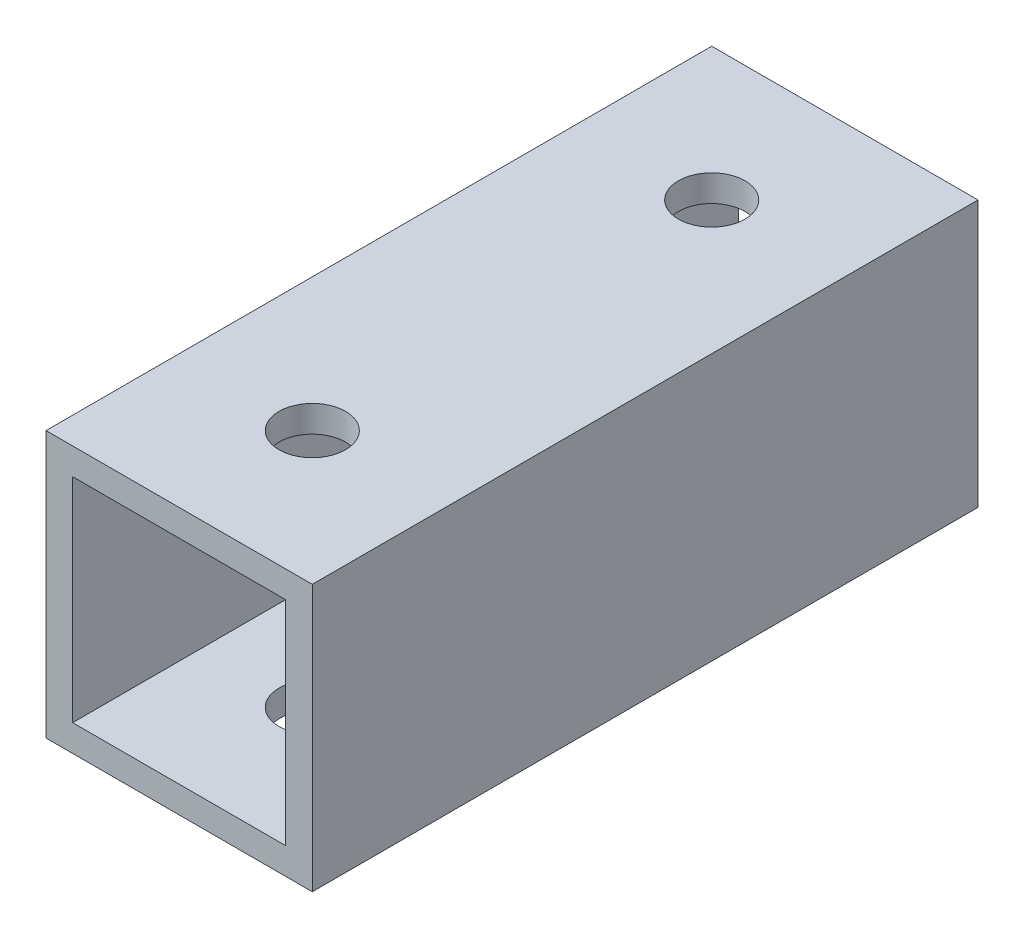
ISO-10303-21;
HEADER;
FILE_DESCRIPTION(('STEP AP214'),'2;1');
FILE_NAME('part.step','',(''),(''),'','','');
FILE_SCHEMA(('AUTOMOTIVE_DESIGN { 1 0 10303 214 1 1 1 1 }'));
ENDSEC;
DATA;
#1=APPLICATION_CONTEXT('core data for automotive mechanical design processes');
#2=APPLICATION_PROTOCOL_DEFINITION('international standard','automotive_design',2000,#1);
#3=PRODUCT_CONTEXT('',#1,'mechanical');
#4=PRODUCT('Part','Part','',(#3));
#5=PRODUCT_RELATED_PRODUCT_CATEGORY('part','',(#4));
#6=PRODUCT_DEFINITION_FORMATION('','',#4);
#7=PRODUCT_DEFINITION_CONTEXT('part definition',#1,'design');
#8=PRODUCT_DEFINITION('design','',#6,#7);
#9=PRODUCT_DEFINITION_SHAPE('','',#8);
#10=(LENGTH_UNIT() NAMED_UNIT(*) SI_UNIT(.MILLI.,.METRE.));
#11=(NAMED_UNIT(*) PLANE_ANGLE_UNIT() SI_UNIT($,.RADIAN.));
#12=(NAMED_UNIT(*) SI_UNIT($,.STERADIAN.) SOLID_ANGLE_UNIT());
#13=UNCERTAINTY_MEASURE_WITH_UNIT(LENGTH_MEASURE(1.E-05),#10,'distance_accuracy_value','');
#14=(GEOMETRIC_REPRESENTATION_CONTEXT(3) GLOBAL_UNCERTAINTY_ASSIGNED_CONTEXT((#13)) GLOBAL_UNIT_ASSIGNED_CONTEXT((#10,
#11,#12)) REPRESENTATION_CONTEXT('',''));
#15=CARTESIAN_POINT('',(0.,0.,0.));
#16=DIRECTION('',(0.,0.,1.));
#17=DIRECTION('',(1.,0.,0.));
#18=AXIS2_PLACEMENT_3D('',#15,#16,#17);
#19=CARTESIAN_POINT('',(0.,0.,50.));
#20=DIRECTION('',(0.,0.,-1.));
#21=DIRECTION('',(-1.,0.,0.));
#22=AXIS2_PLACEMENT_3D('',#19,#20,#21);
#23=PLANE('',#22);
#24=DIRECTION('',(0.,1.,0.));
#25=VECTOR('',#24,1.);
#26=CARTESIAN_POINT('',(10.,-10.,50.));
#27=LINE('',#26,#25);
#28=CARTESIAN_POINT('',(10.,-10.,50.));
#29=VERTEX_POINT('',#28);
#30=CARTESIAN_POINT('',(10.,10.,50.));
#31=VERTEX_POINT('',#30);
#32=EDGE_CURVE('E162',#29,#31,#27,.T.);
#33=ORIENTED_EDGE('',*,*,#32,.T.);
#34=DIRECTION('',(-1.,0.,0.));
#35=VECTOR('',#34,1.);
#36=CARTESIAN_POINT('',(-10.,10.,50.));
#37=LINE('',#36,#35);
#38=CARTESIAN_POINT('',(-10.,10.,50.));
#39=VERTEX_POINT('',#38);
#40=EDGE_CURVE('E166',#31,#39,#37,.T.);
#41=ORIENTED_EDGE('',*,*,#40,.T.);
#42=DIRECTION('',(0.,-1.,0.));
#43=VECTOR('',#42,1.);
#44=CARTESIAN_POINT('',(-10.,-10.,50.));
#45=LINE('',#44,#43);
#46=CARTESIAN_POINT('',(-10.,-10.,50.));
#47=VERTEX_POINT('',#46);
#48=EDGE_CURVE('E170',#39,#47,#45,.T.);
#49=ORIENTED_EDGE('',*,*,#48,.T.);
#50=DIRECTION('',(1.,0.,0.));
#51=VECTOR('',#50,1.);
#52=CARTESIAN_POINT('',(-10.,-10.,50.));
#53=LINE('',#52,#51);
#54=EDGE_CURVE('E173',#47,#29,#53,.T.);
#55=ORIENTED_EDGE('',*,*,#54,.T.);
#56=EDGE_LOOP('',(#33,#41,#49,#55));
#57=FACE_BOUND('',#56,.T.);
#58=DIRECTION('',(0.,1.,0.));
#59=VECTOR('',#58,1.);
#60=CARTESIAN_POINT('',(8.,-7.99999999999999,50.));
#61=LINE('',#60,#59);
#62=CARTESIAN_POINT('',(8.,-7.99999999999999,50.));
#63=VERTEX_POINT('',#62);
#64=CARTESIAN_POINT('',(8.,8.,50.));
#65=VERTEX_POINT('',#64);
#66=EDGE_CURVE('E112',#63,#65,#61,.T.);
#67=ORIENTED_EDGE('',*,*,#66,.F.);
#68=DIRECTION('',(1.,0.,0.));
#69=VECTOR('',#68,1.);
#70=CARTESIAN_POINT('',(-8.,-7.99999999999999,50.));
#71=LINE('',#70,#69);
#72=CARTESIAN_POINT('',(-8.,-7.99999999999999,50.));
#73=VERTEX_POINT('',#72);
#74=EDGE_CURVE('E138',#73,#63,#71,.T.);
#75=ORIENTED_EDGE('',*,*,#74,.F.);
#76=DIRECTION('',(0.,-1.,0.));
#77=VECTOR('',#76,1.);
#78=CARTESIAN_POINT('',(-8.,-7.99999999999999,50.));
#79=LINE('',#78,#77);
#80=CARTESIAN_POINT('',(-8.,8.,50.));
#81=VERTEX_POINT('',#80);
#82=EDGE_CURVE('E134',#81,#73,#79,.T.);
#83=ORIENTED_EDGE('',*,*,#82,.F.);
#84=DIRECTION('',(-1.,0.,0.));
#85=VECTOR('',#84,1.);
#86=CARTESIAN_POINT('',(-8.,8.,50.));
#87=LINE('',#86,#85);
#88=EDGE_CURVE('E121',#65,#81,#87,.T.);
#89=ORIENTED_EDGE('',*,*,#88,.F.);
#90=EDGE_LOOP('',(#67,#75,#83,#89));
#91=FACE_BOUND('',#90,.T.);
#92=ADVANCED_FACE('F44',(#57,#91),#23,.F.);
#93=CARTESIAN_POINT('',(0.,0.,0.));
#94=DIRECTION('',(0.,0.,-1.));
#95=DIRECTION('',(-1.,0.,0.));
#96=AXIS2_PLACEMENT_3D('',#93,#94,#95);
#97=PLANE('',#96);
#98=DIRECTION('',(0.,1.,0.));
#99=VECTOR('',#98,1.);
#100=CARTESIAN_POINT('',(10.,-10.,0.));
#101=LINE('',#100,#99);
#102=CARTESIAN_POINT('',(10.,-10.,0.));
#103=VERTEX_POINT('',#102);
#104=CARTESIAN_POINT('',(10.,10.,0.));
#105=VERTEX_POINT('',#104);
#106=EDGE_CURVE('E130',#103,#105,#101,.T.);
#107=ORIENTED_EDGE('',*,*,#106,.F.);
#108=DIRECTION('',(1.,0.,0.));
#109=VECTOR('',#108,1.);
#110=CARTESIAN_POINT('',(-10.,-10.,0.));
#111=LINE('',#110,#109);
#112=CARTESIAN_POINT('',(-10.,-10.,0.));
#113=VERTEX_POINT('',#112);
#114=EDGE_CURVE('E167',#113,#103,#111,.T.);
#115=ORIENTED_EDGE('',*,*,#114,.F.);
#116=DIRECTION('',(0.,-1.,0.));
#117=VECTOR('',#116,1.);
#118=CARTESIAN_POINT('',(-10.,-10.,0.));
#119=LINE('',#118,#117);
#120=CARTESIAN_POINT('',(-10.,10.,0.));
#121=VERTEX_POINT('',#120);
#122=EDGE_CURVE('E183',#121,#113,#119,.T.);
#123=ORIENTED_EDGE('',*,*,#122,.F.);
#124=DIRECTION('',(-1.,0.,0.));
#125=VECTOR('',#124,1.);
#126=CARTESIAN_POINT('',(-10.,10.,0.));
#127=LINE('',#126,#125);
#128=EDGE_CURVE('E180',#105,#121,#127,.T.);
#129=ORIENTED_EDGE('',*,*,#128,.F.);
#130=EDGE_LOOP('',(#107,#115,#123,#129));
#131=FACE_BOUND('',#130,.T.);
#132=DIRECTION('',(1.,0.,0.));
#133=VECTOR('',#132,1.);
#134=CARTESIAN_POINT('',(-8.,-7.99999999999999,0.));
#135=LINE('',#134,#133);
#136=CARTESIAN_POINT('',(-8.,-7.99999999999999,0.));
#137=VERTEX_POINT('',#136);
#138=CARTESIAN_POINT('',(8.,-7.99999999999999,0.));
#139=VERTEX_POINT('',#138);
#140=EDGE_CURVE('E122',#137,#139,#135,.T.);
#141=ORIENTED_EDGE('',*,*,#140,.T.);
#142=DIRECTION('',(0.,1.,0.));
#143=VECTOR('',#142,1.);
#144=CARTESIAN_POINT('',(8.,-7.99999999999999,0.));
#145=LINE('',#144,#143);
#146=CARTESIAN_POINT('',(8.,8.,0.));
#147=VERTEX_POINT('',#146);
#148=EDGE_CURVE('E70',#139,#147,#145,.T.);
#149=ORIENTED_EDGE('',*,*,#148,.T.);
#150=DIRECTION('',(-1.,0.,0.));
#151=VECTOR('',#150,1.);
#152=CARTESIAN_POINT('',(-8.,8.,0.));
#153=LINE('',#152,#151);
#154=CARTESIAN_POINT('',(-8.,8.,0.));
#155=VERTEX_POINT('',#154);
#156=EDGE_CURVE('E128',#147,#155,#153,.T.);
#157=ORIENTED_EDGE('',*,*,#156,.T.);
#158=DIRECTION('',(0.,-1.,0.));
#159=VECTOR('',#158,1.);
#160=CARTESIAN_POINT('',(-8.,-7.99999999999999,0.));
#161=LINE('',#160,#159);
#162=EDGE_CURVE('E149',#155,#137,#161,.T.);
#163=ORIENTED_EDGE('',*,*,#162,.T.);
#164=EDGE_LOOP('',(#141,#149,#157,#163));
#165=FACE_BOUND('',#164,.T.);
#166=ADVANCED_FACE('F242',(#131,#165),#97,.T.);
#167=CARTESIAN_POINT('',(10.,-10.,50.));
#168=DIRECTION('',(-1.,0.,0.));
#169=DIRECTION('',(0.,0.,1.));
#170=AXIS2_PLACEMENT_3D('',#167,#168,#169);
#171=PLANE('',#170);
#172=ORIENTED_EDGE('',*,*,#106,.T.);
#173=DIRECTION('',(0.,0.,-1.));
#174=VECTOR('',#173,1.);
#175=CARTESIAN_POINT('',(10.,10.,50.));
#176=LINE('',#175,#174);
#177=EDGE_CURVE('E11',#31,#105,#176,.T.);
#178=ORIENTED_EDGE('',*,*,#177,.F.);
#179=ORIENTED_EDGE('',*,*,#32,.F.);
#180=DIRECTION('',(0.,0.,-1.));
#181=VECTOR('',#180,1.);
#182=CARTESIAN_POINT('',(10.,-10.,50.));
#183=LINE('',#182,#181);
#184=EDGE_CURVE('E176',#29,#103,#183,.T.);
#185=ORIENTED_EDGE('',*,*,#184,.T.);
#186=EDGE_LOOP('',(#172,#178,#179,#185));
#187=FACE_BOUND('',#186,.T.);
#188=ADVANCED_FACE('F46',(#187),#171,.F.);
#189=CARTESIAN_POINT('',(-10.,10.,50.));
#190=DIRECTION('',(0.,-1.,0.));
#191=DIRECTION('',(0.,0.,-1.));
#192=AXIS2_PLACEMENT_3D('',#189,#190,#191);
#193=PLANE('',#192);
#194=CARTESIAN_POINT('',(0.,10.,10.));
#195=DIRECTION('',(0.,1.,0.));
#196=DIRECTION('',(0.,0.,1.));
#197=AXIS2_PLACEMENT_3D('',#194,#195,#196);
#198=CIRCLE('',#197,2.5);
#199=CARTESIAN_POINT('',(0.,10.,12.5));
#200=VERTEX_POINT('',#199);
#201=EDGE_CURVE('E209',#200,#200,#198,.T.);
#202=ORIENTED_EDGE('',*,*,#201,.F.);
#203=EDGE_LOOP('',(#202));
#204=FACE_BOUND('',#203,.T.);
#205=CARTESIAN_POINT('',(0.,10.,40.));
#206=DIRECTION('',(0.,1.,0.));
#207=DIRECTION('',(0.,0.,1.));
#208=AXIS2_PLACEMENT_3D('',#205,#206,#207);
#209=CIRCLE('',#208,2.5);
#210=CARTESIAN_POINT('',(0.,10.,42.5));
#211=VERTEX_POINT('',#210);
#212=EDGE_CURVE('E215',#211,#211,#209,.T.);
#213=ORIENTED_EDGE('',*,*,#212,.F.);
#214=EDGE_LOOP('',(#213));
#215=FACE_BOUND('',#214,.T.);
#216=ORIENTED_EDGE('',*,*,#128,.T.);
#217=DIRECTION('',(0.,0.,-1.));
#218=VECTOR('',#217,1.);
#219=CARTESIAN_POINT('',(-10.,10.,50.));
#220=LINE('',#219,#218);
#221=EDGE_CURVE('E54',#39,#121,#220,.T.);
#222=ORIENTED_EDGE('',*,*,#221,.F.);
#223=ORIENTED_EDGE('',*,*,#40,.F.);
#224=ORIENTED_EDGE('',*,*,#177,.T.);
#225=EDGE_LOOP('',(#216,#222,#223,#224));
#226=FACE_BOUND('',#225,.T.);
#227=ADVANCED_FACE('F269',(#204,#215,#226),#193,.F.);
#228=CARTESIAN_POINT('',(-10.,-10.,50.));
#229=DIRECTION('',(1.,0.,0.));
#230=DIRECTION('',(0.,0.,-1.));
#231=AXIS2_PLACEMENT_3D('',#228,#229,#230);
#232=PLANE('',#231);
#233=ORIENTED_EDGE('',*,*,#122,.T.);
#234=DIRECTION('',(0.,0.,-1.));
#235=VECTOR('',#234,1.);
#236=CARTESIAN_POINT('',(-10.,-10.,50.));
#237=LINE('',#236,#235);
#238=EDGE_CURVE('E191',#47,#113,#237,.T.);
#239=ORIENTED_EDGE('',*,*,#238,.F.);
#240=ORIENTED_EDGE('',*,*,#48,.F.);
#241=ORIENTED_EDGE('',*,*,#221,.T.);
#242=EDGE_LOOP('',(#233,#239,#240,#241));
#243=FACE_BOUND('',#242,.T.);
#244=ADVANCED_FACE('F266',(#243),#232,.F.);
#245=CARTESIAN_POINT('',(-10.,-10.,50.));
#246=DIRECTION('',(0.,1.,0.));
#247=DIRECTION('',(0.,0.,1.));
#248=AXIS2_PLACEMENT_3D('',#245,#246,#247);
#249=PLANE('',#248);
#250=CARTESIAN_POINT('',(0.,-10.,10.));
#251=DIRECTION('',(0.,1.,0.));
#252=DIRECTION('',(0.,0.,1.));
#253=AXIS2_PLACEMENT_3D('',#250,#251,#252);
#254=CIRCLE('',#253,2.5);
#255=CARTESIAN_POINT('',(0.,-10.,12.5));
#256=VERTEX_POINT('',#255);
#257=EDGE_CURVE('E201',#256,#256,#254,.F.);
#258=ORIENTED_EDGE('',*,*,#257,.F.);
#259=EDGE_LOOP('',(#258));
#260=FACE_BOUND('',#259,.T.);
#261=CARTESIAN_POINT('',(0.,-10.,40.));
#262=DIRECTION('',(0.,1.,0.));
#263=DIRECTION('',(0.,0.,1.));
#264=AXIS2_PLACEMENT_3D('',#261,#262,#263);
#265=CIRCLE('',#264,2.5);
#266=CARTESIAN_POINT('',(0.,-10.,42.5));
#267=VERTEX_POINT('',#266);
#268=EDGE_CURVE('E218',#267,#267,#265,.F.);
#269=ORIENTED_EDGE('',*,*,#268,.F.);
#270=EDGE_LOOP('',(#269));
#271=FACE_BOUND('',#270,.T.);
#272=ORIENTED_EDGE('',*,*,#114,.T.);
#273=ORIENTED_EDGE('',*,*,#184,.F.);
#274=ORIENTED_EDGE('',*,*,#54,.F.);
#275=ORIENTED_EDGE('',*,*,#238,.T.);
#276=EDGE_LOOP('',(#272,#273,#274,#275));
#277=FACE_BOUND('',#276,.T.);
#278=ADVANCED_FACE('F263',(#260,#271,#277),#249,.F.);
#279=CARTESIAN_POINT('',(8.,-7.99999999999999,50.));
#280=DIRECTION('',(-1.,0.,0.));
#281=DIRECTION('',(0.,0.,1.));
#282=AXIS2_PLACEMENT_3D('',#279,#280,#281);
#283=PLANE('',#282);
#284=ORIENTED_EDGE('',*,*,#148,.F.);
#285=DIRECTION('',(0.,0.,-1.));
#286=VECTOR('',#285,1.);
#287=CARTESIAN_POINT('',(8.,-7.99999999999999,50.));
#288=LINE('',#287,#286);
#289=EDGE_CURVE('E116',#63,#139,#288,.T.);
#290=ORIENTED_EDGE('',*,*,#289,.F.);
#291=ORIENTED_EDGE('',*,*,#66,.T.);
#292=DIRECTION('',(0.,0.,-1.));
#293=VECTOR('',#292,1.);
#294=CARTESIAN_POINT('',(8.,8.,50.));
#295=LINE('',#294,#293);
#296=EDGE_CURVE('E115',#65,#147,#295,.T.);
#297=ORIENTED_EDGE('',*,*,#296,.T.);
#298=EDGE_LOOP('',(#284,#290,#291,#297));
#299=FACE_BOUND('',#298,.T.);
#300=ADVANCED_FACE('F114',(#299),#283,.T.);
#301=CARTESIAN_POINT('',(-8.,8.,50.));
#302=DIRECTION('',(0.,-1.,0.));
#303=DIRECTION('',(0.,0.,-1.));
#304=AXIS2_PLACEMENT_3D('',#301,#302,#303);
#305=PLANE('',#304);
#306=CARTESIAN_POINT('',(0.,8.,10.));
#307=DIRECTION('',(0.,-1.,0.));
#308=DIRECTION('',(0.,0.,-1.));
#309=AXIS2_PLACEMENT_3D('',#306,#307,#308);
#310=CIRCLE('',#309,2.5);
#311=CARTESIAN_POINT('',(0.,8.,12.5));
#312=VERTEX_POINT('',#311);
#313=EDGE_CURVE('E146',#312,#312,#310,.T.);
#314=ORIENTED_EDGE('',*,*,#313,.F.);
#315=EDGE_LOOP('',(#314));
#316=FACE_BOUND('',#315,.T.);
#317=CARTESIAN_POINT('',(0.,8.,40.));
#318=DIRECTION('',(0.,-1.,0.));
#319=DIRECTION('',(0.,0.,-1.));
#320=AXIS2_PLACEMENT_3D('',#317,#318,#319);
#321=CIRCLE('',#320,2.5);
#322=CARTESIAN_POINT('',(0.,8.,42.5));
#323=VERTEX_POINT('',#322);
#324=EDGE_CURVE('E200',#323,#323,#321,.T.);
#325=ORIENTED_EDGE('',*,*,#324,.F.);
#326=EDGE_LOOP('',(#325));
#327=FACE_BOUND('',#326,.T.);
#328=ORIENTED_EDGE('',*,*,#156,.F.);
#329=ORIENTED_EDGE('',*,*,#296,.F.);
#330=ORIENTED_EDGE('',*,*,#88,.T.);
#331=DIRECTION('',(0.,0.,-1.));
#332=VECTOR('',#331,1.);
#333=CARTESIAN_POINT('',(-8.,8.,50.));
#334=LINE('',#333,#332);
#335=EDGE_CURVE('E131',#81,#155,#334,.T.);
#336=ORIENTED_EDGE('',*,*,#335,.T.);
#337=EDGE_LOOP('',(#328,#329,#330,#336));
#338=FACE_BOUND('',#337,.T.);
#339=ADVANCED_FACE('F125',(#316,#327,#338),#305,.T.);
#340=CARTESIAN_POINT('',(-8.,-7.99999999999999,50.));
#341=DIRECTION('',(1.,0.,0.));
#342=DIRECTION('',(0.,0.,-1.));
#343=AXIS2_PLACEMENT_3D('',#340,#341,#342);
#344=PLANE('',#343);
#345=ORIENTED_EDGE('',*,*,#162,.F.);
#346=ORIENTED_EDGE('',*,*,#335,.F.);
#347=ORIENTED_EDGE('',*,*,#82,.T.);
#348=DIRECTION('',(0.,0.,-1.));
#349=VECTOR('',#348,1.);
#350=CARTESIAN_POINT('',(-8.,-7.99999999999999,50.));
#351=LINE('',#350,#349);
#352=EDGE_CURVE('E62',#73,#137,#351,.T.);
#353=ORIENTED_EDGE('',*,*,#352,.T.);
#354=EDGE_LOOP('',(#345,#346,#347,#353));
#355=FACE_BOUND('',#354,.T.);
#356=ADVANCED_FACE('F238',(#355),#344,.T.);
#357=CARTESIAN_POINT('',(-8.,-7.99999999999999,50.));
#358=DIRECTION('',(0.,1.,0.));
#359=DIRECTION('',(0.,0.,1.));
#360=AXIS2_PLACEMENT_3D('',#357,#358,#359);
#361=PLANE('',#360);
#362=CARTESIAN_POINT('',(0.,-7.99999999999999,10.));
#363=DIRECTION('',(0.,1.,0.));
#364=DIRECTION('',(0.,0.,1.));
#365=AXIS2_PLACEMENT_3D('',#362,#363,#364);
#366=CIRCLE('',#365,2.5);
#367=CARTESIAN_POINT('',(0.,-7.99999999999999,12.5));
#368=VERTEX_POINT('',#367);
#369=EDGE_CURVE('E48',#368,#368,#366,.T.);
#370=ORIENTED_EDGE('',*,*,#369,.F.);
#371=EDGE_LOOP('',(#370));
#372=FACE_BOUND('',#371,.T.);
#373=CARTESIAN_POINT('',(0.,-7.99999999999999,40.));
#374=DIRECTION('',(0.,1.,0.));
#375=DIRECTION('',(0.,0.,1.));
#376=AXIS2_PLACEMENT_3D('',#373,#374,#375);
#377=CIRCLE('',#376,2.5);
#378=CARTESIAN_POINT('',(0.,-7.99999999999999,42.5));
#379=VERTEX_POINT('',#378);
#380=EDGE_CURVE('E197',#379,#379,#377,.T.);
#381=ORIENTED_EDGE('',*,*,#380,.F.);
#382=EDGE_LOOP('',(#381));
#383=FACE_BOUND('',#382,.T.);
#384=ORIENTED_EDGE('',*,*,#140,.F.);
#385=ORIENTED_EDGE('',*,*,#352,.F.);
#386=ORIENTED_EDGE('',*,*,#74,.T.);
#387=ORIENTED_EDGE('',*,*,#289,.T.);
#388=EDGE_LOOP('',(#384,#385,#386,#387));
#389=FACE_BOUND('',#388,.T.);
#390=ADVANCED_FACE('F234',(#372,#383,#389),#361,.T.);
#391=CARTESIAN_POINT('',(0.,-17.0710678118655,40.));
#392=DIRECTION('',(0.,1.,0.));
#393=DIRECTION('',(0.,0.,1.));
#394=AXIS2_PLACEMENT_3D('',#391,#392,#393);
#395=CYLINDRICAL_SURFACE('',#394,2.5);
#396=CARTESIAN_POINT('',(0.,-7.99999999999999,42.5));
#397=CARTESIAN_POINT('',(0.,-8.02083333333333,42.5));
#398=CARTESIAN_POINT('',(0.,-8.04166666666666,42.5));
#399=CARTESIAN_POINT('',(0.,-8.08333333333333,42.5));
#400=CARTESIAN_POINT('',(0.,-8.10416666666666,42.5));
#401=CARTESIAN_POINT('',(0.,-8.14583333333333,42.5));
#402=CARTESIAN_POINT('',(0.,-8.16666666666666,42.5));
#403=CARTESIAN_POINT('',(0.,-8.20833333333333,42.5));
#404=CARTESIAN_POINT('',(0.,-8.22916666666666,42.5));
#405=CARTESIAN_POINT('',(0.,-8.27083333333333,42.5));
#406=CARTESIAN_POINT('',(0.,-8.29166666666666,42.5));
#407=CARTESIAN_POINT('',(0.,-8.33333333333333,42.5));
#408=CARTESIAN_POINT('',(0.,-8.35416666666666,42.5));
#409=CARTESIAN_POINT('',(0.,-8.39583333333333,42.5));
#410=CARTESIAN_POINT('',(0.,-8.41666666666666,42.5));
#411=CARTESIAN_POINT('',(0.,-8.45833333333333,42.5));
#412=CARTESIAN_POINT('',(0.,-8.47916666666666,42.5));
#413=CARTESIAN_POINT('',(0.,-8.52083333333333,42.5));
#414=CARTESIAN_POINT('',(0.,-8.54166666666666,42.5));
#415=CARTESIAN_POINT('',(0.,-8.58333333333333,42.5));
#416=CARTESIAN_POINT('',(0.,-8.60416666666666,42.5));
#417=CARTESIAN_POINT('',(0.,-8.64583333333333,42.5));
#418=CARTESIAN_POINT('',(0.,-8.66666666666666,42.5));
#419=CARTESIAN_POINT('',(0.,-8.70833333333333,42.5));
#420=CARTESIAN_POINT('',(0.,-8.72916666666666,42.5));
#421=CARTESIAN_POINT('',(0.,-8.77083333333333,42.5));
#422=CARTESIAN_POINT('',(0.,-8.79166666666667,42.5));
#423=CARTESIAN_POINT('',(0.,-8.83333333333333,42.5));
#424=CARTESIAN_POINT('',(0.,-8.85416666666667,42.5));
#425=CARTESIAN_POINT('',(0.,-8.89583333333333,42.5));
#426=CARTESIAN_POINT('',(0.,-8.91666666666667,42.5));
#427=CARTESIAN_POINT('',(0.,-8.95833333333333,42.5));
#428=CARTESIAN_POINT('',(0.,-8.97916666666667,42.5));
#429=CARTESIAN_POINT('',(0.,-9.02083333333333,42.5));
#430=CARTESIAN_POINT('',(0.,-9.04166666666667,42.5));
#431=CARTESIAN_POINT('',(0.,-9.08333333333333,42.5));
#432=CARTESIAN_POINT('',(0.,-9.10416666666667,42.5));
#433=CARTESIAN_POINT('',(0.,-9.14583333333333,42.5));
#434=CARTESIAN_POINT('',(0.,-9.16666666666667,42.5));
#435=CARTESIAN_POINT('',(0.,-9.20833333333333,42.5));
#436=CARTESIAN_POINT('',(0.,-9.22916666666667,42.5));
#437=CARTESIAN_POINT('',(0.,-9.27083333333333,42.5));
#438=CARTESIAN_POINT('',(0.,-9.29166666666667,42.5));
#439=CARTESIAN_POINT('',(0.,-9.33333333333333,42.5));
#440=CARTESIAN_POINT('',(0.,-9.35416666666667,42.5));
#441=CARTESIAN_POINT('',(0.,-9.39583333333333,42.5));
#442=CARTESIAN_POINT('',(0.,-9.41666666666667,42.5));
#443=CARTESIAN_POINT('',(0.,-9.45833333333333,42.5));
#444=CARTESIAN_POINT('',(0.,-9.47916666666667,42.5));
#445=CARTESIAN_POINT('',(0.,-9.52083333333333,42.5));
#446=CARTESIAN_POINT('',(0.,-9.54166666666667,42.5));
#447=CARTESIAN_POINT('',(0.,-9.58333333333333,42.5));
#448=CARTESIAN_POINT('',(0.,-9.60416666666667,42.5));
#449=CARTESIAN_POINT('',(0.,-9.64583333333333,42.5));
#450=CARTESIAN_POINT('',(0.,-9.66666666666667,42.5));
#451=CARTESIAN_POINT('',(0.,-9.70833333333333,42.5));
#452=CARTESIAN_POINT('',(0.,-9.72916666666667,42.5));
#453=CARTESIAN_POINT('',(0.,-9.77083333333333,42.5));
#454=CARTESIAN_POINT('',(0.,-9.79166666666667,42.5));
#455=CARTESIAN_POINT('',(0.,-9.83333333333333,42.5));
#456=CARTESIAN_POINT('',(0.,-9.85416666666667,42.5));
#457=CARTESIAN_POINT('',(0.,-9.89583333333333,42.5));
#458=CARTESIAN_POINT('',(0.,-9.91666666666667,42.5));
#459=CARTESIAN_POINT('',(0.,-9.95833333333333,42.5));
#460=CARTESIAN_POINT('',(0.,-9.97916666666667,42.5));
#461=CARTESIAN_POINT('',(0.,-10.,42.5));
#462=B_SPLINE_CURVE_WITH_KNOTS('',3,(#396,#397,#398,#399,#400,#401,#402,#403,#404,#405,#406,
#407,#408,#409,#410,#411,#412,#413,#414,#415,#416,#417,#418,#419,#420,#421,#422,#423,#424,#425,
#426,#427,#428,#429,#430,#431,#432,#433,#434,#435,#436,#437,#438,#439,#440,#441,#442,#443,#444,
#445,#446,#447,#448,#449,#450,#451,#452,#453,#454,#455,#456,#457,#458,#459,#460,#461),
.UNSPECIFIED.,.F.,.F.,(4,2,2,2,2,2,2,2,2,2,2,2,2,2,2,2,2,2,2,2,2,2,2,2,2,2,2,2,2,2,2,2,4),(0.,
0.0625000000000001,0.125,0.1875,0.25,0.312500000000002,0.375000000000002,0.437500000000002,
0.500000000000002,0.562500000000002,0.625000000000002,0.687500000000002,0.750000000000004,
0.812500000000004,0.875000000000004,0.937500000000004,1.,1.0625,1.125,1.1875,1.25,1.3125,
1.37500000000001,1.43750000000001,1.50000000000001,1.56250000000001,1.62500000000001,
1.68750000000001,1.75000000000001,1.81250000000001,1.87500000000001,1.93750000000001,
2.00000000000001),.UNSPECIFIED.);
#463=EDGE_CURVE('BSEAM237',#379,#267,#462,.T.);
#464=ORIENTED_EDGE('',*,*,#380,.T.);
#465=ORIENTED_EDGE('',*,*,#268,.T.);
#466=ORIENTED_EDGE('',*,*,#463,.T.);
#467=ORIENTED_EDGE('',*,*,#463,.F.);
#468=EDGE_LOOP('',(#464,#466,#465,#467));
#469=FACE_BOUND('',#468,.T.);
#470=ADVANCED_FACE('F237',(#469),#395,.F.);
#471=CARTESIAN_POINT('',(0.,-17.0710678118655,10.));
#472=DIRECTION('',(0.,1.,0.));
#473=DIRECTION('',(0.,0.,1.));
#474=AXIS2_PLACEMENT_3D('',#471,#472,#473);
#475=CYLINDRICAL_SURFACE('',#474,2.5);
#476=CARTESIAN_POINT('',(0.,-7.99999999999999,12.5));
#477=CARTESIAN_POINT('',(0.,-8.02083333333333,12.5));
#478=CARTESIAN_POINT('',(0.,-8.04166666666666,12.5));
#479=CARTESIAN_POINT('',(0.,-8.08333333333333,12.5));
#480=CARTESIAN_POINT('',(0.,-8.10416666666666,12.5));
#481=CARTESIAN_POINT('',(0.,-8.14583333333333,12.5));
#482=CARTESIAN_POINT('',(0.,-8.16666666666666,12.5));
#483=CARTESIAN_POINT('',(0.,-8.20833333333333,12.5));
#484=CARTESIAN_POINT('',(0.,-8.22916666666666,12.5));
#485=CARTESIAN_POINT('',(0.,-8.27083333333333,12.5));
#486=CARTESIAN_POINT('',(0.,-8.29166666666666,12.5));
#487=CARTESIAN_POINT('',(0.,-8.33333333333333,12.5));
#488=CARTESIAN_POINT('',(0.,-8.35416666666666,12.5));
#489=CARTESIAN_POINT('',(0.,-8.39583333333333,12.5));
#490=CARTESIAN_POINT('',(0.,-8.41666666666666,12.5));
#491=CARTESIAN_POINT('',(0.,-8.45833333333333,12.5));
#492=CARTESIAN_POINT('',(0.,-8.47916666666666,12.5));
#493=CARTESIAN_POINT('',(0.,-8.52083333333333,12.5));
#494=CARTESIAN_POINT('',(0.,-8.54166666666666,12.5));
#495=CARTESIAN_POINT('',(0.,-8.58333333333333,12.5));
#496=CARTESIAN_POINT('',(0.,-8.60416666666666,12.5));
#497=CARTESIAN_POINT('',(0.,-8.64583333333333,12.5));
#498=CARTESIAN_POINT('',(0.,-8.66666666666666,12.5));
#499=CARTESIAN_POINT('',(0.,-8.70833333333333,12.5));
#500=CARTESIAN_POINT('',(0.,-8.72916666666666,12.5));
#501=CARTESIAN_POINT('',(0.,-8.77083333333333,12.5));
#502=CARTESIAN_POINT('',(0.,-8.79166666666667,12.5));
#503=CARTESIAN_POINT('',(0.,-8.83333333333333,12.5));
#504=CARTESIAN_POINT('',(0.,-8.85416666666667,12.5));
#505=CARTESIAN_POINT('',(0.,-8.89583333333333,12.5));
#506=CARTESIAN_POINT('',(0.,-8.91666666666667,12.5));
#507=CARTESIAN_POINT('',(0.,-8.95833333333333,12.5));
#508=CARTESIAN_POINT('',(0.,-8.97916666666667,12.5));
#509=CARTESIAN_POINT('',(0.,-9.02083333333333,12.5));
#510=CARTESIAN_POINT('',(0.,-9.04166666666667,12.5));
#511=CARTESIAN_POINT('',(0.,-9.08333333333333,12.5));
#512=CARTESIAN_POINT('',(0.,-9.10416666666667,12.5));
#513=CARTESIAN_POINT('',(0.,-9.14583333333333,12.5));
#514=CARTESIAN_POINT('',(0.,-9.16666666666667,12.5));
#515=CARTESIAN_POINT('',(0.,-9.20833333333333,12.5));
#516=CARTESIAN_POINT('',(0.,-9.22916666666667,12.5));
#517=CARTESIAN_POINT('',(0.,-9.27083333333333,12.5));
#518=CARTESIAN_POINT('',(0.,-9.29166666666667,12.5));
#519=CARTESIAN_POINT('',(0.,-9.33333333333333,12.5));
#520=CARTESIAN_POINT('',(0.,-9.35416666666667,12.5));
#521=CARTESIAN_POINT('',(0.,-9.39583333333333,12.5));
#522=CARTESIAN_POINT('',(0.,-9.41666666666667,12.5));
#523=CARTESIAN_POINT('',(0.,-9.45833333333333,12.5));
#524=CARTESIAN_POINT('',(0.,-9.47916666666667,12.5));
#525=CARTESIAN_POINT('',(0.,-9.52083333333333,12.5));
#526=CARTESIAN_POINT('',(0.,-9.54166666666667,12.5));
#527=CARTESIAN_POINT('',(0.,-9.58333333333333,12.5));
#528=CARTESIAN_POINT('',(0.,-9.60416666666667,12.5));
#529=CARTESIAN_POINT('',(0.,-9.64583333333333,12.5));
#530=CARTESIAN_POINT('',(0.,-9.66666666666667,12.5));
#531=CARTESIAN_POINT('',(0.,-9.70833333333333,12.5));
#532=CARTESIAN_POINT('',(0.,-9.72916666666667,12.5));
#533=CARTESIAN_POINT('',(0.,-9.77083333333333,12.5));
#534=CARTESIAN_POINT('',(0.,-9.79166666666667,12.5));
#535=CARTESIAN_POINT('',(0.,-9.83333333333333,12.5));
#536=CARTESIAN_POINT('',(0.,-9.85416666666667,12.5));
#537=CARTESIAN_POINT('',(0.,-9.89583333333333,12.5));
#538=CARTESIAN_POINT('',(0.,-9.91666666666667,12.5));
#539=CARTESIAN_POINT('',(0.,-9.95833333333333,12.5));
#540=CARTESIAN_POINT('',(0.,-9.97916666666667,12.5));
#541=CARTESIAN_POINT('',(0.,-10.,12.5));
#542=B_SPLINE_CURVE_WITH_KNOTS('',3,(#476,#477,#478,#479,#480,#481,#482,#483,#484,#485,#486,
#487,#488,#489,#490,#491,#492,#493,#494,#495,#496,#497,#498,#499,#500,#501,#502,#503,#504,#505,
#506,#507,#508,#509,#510,#511,#512,#513,#514,#515,#516,#517,#518,#519,#520,#521,#522,#523,#524,
#525,#526,#527,#528,#529,#530,#531,#532,#533,#534,#535,#536,#537,#538,#539,#540,#541),
.UNSPECIFIED.,.F.,.F.,(4,2,2,2,2,2,2,2,2,2,2,2,2,2,2,2,2,2,2,2,2,2,2,2,2,2,2,2,2,2,2,2,4),(0.,
0.0625000000000001,0.125,0.1875,0.25,0.312500000000002,0.375000000000002,0.437500000000002,
0.500000000000002,0.562500000000002,0.625000000000002,0.687500000000002,0.750000000000004,
0.812500000000004,0.875000000000004,0.937500000000004,1.,1.0625,1.125,1.1875,1.25,1.3125,
1.37500000000001,1.43750000000001,1.50000000000001,1.56250000000001,1.62500000000001,
1.68750000000001,1.75000000000001,1.81250000000001,1.87500000000001,1.93750000000001,
2.00000000000001),.UNSPECIFIED.);
#543=EDGE_CURVE('BSEAM232',#368,#256,#542,.T.);
#544=ORIENTED_EDGE('',*,*,#369,.T.);
#545=ORIENTED_EDGE('',*,*,#257,.T.);
#546=ORIENTED_EDGE('',*,*,#543,.T.);
#547=ORIENTED_EDGE('',*,*,#543,.F.);
#548=EDGE_LOOP('',(#544,#546,#545,#547));
#549=FACE_BOUND('',#548,.T.);
#550=ADVANCED_FACE('F232',(#549),#475,.F.);
#551=CARTESIAN_POINT('',(0.,8.,42.5));
#552=CARTESIAN_POINT('',(0.,8.02083333333334,42.5));
#553=CARTESIAN_POINT('',(0.,8.04166666666667,42.5));
#554=CARTESIAN_POINT('',(0.,8.08333333333334,42.5));
#555=CARTESIAN_POINT('',(0.,8.10416666666667,42.5));
#556=CARTESIAN_POINT('',(0.,8.14583333333334,42.5));
#557=CARTESIAN_POINT('',(0.,8.16666666666667,42.5));
#558=CARTESIAN_POINT('',(0.,8.20833333333334,42.5));
#559=CARTESIAN_POINT('',(0.,8.22916666666667,42.5));
#560=CARTESIAN_POINT('',(0.,8.27083333333334,42.5));
#561=CARTESIAN_POINT('',(0.,8.29166666666667,42.5));
#562=CARTESIAN_POINT('',(0.,8.33333333333334,42.5));
#563=CARTESIAN_POINT('',(0.,8.35416666666667,42.5));
#564=CARTESIAN_POINT('',(0.,8.39583333333334,42.5));
#565=CARTESIAN_POINT('',(0.,8.41666666666667,42.5));
#566=CARTESIAN_POINT('',(0.,8.45833333333334,42.5));
#567=CARTESIAN_POINT('',(0.,8.47916666666667,42.5));
#568=CARTESIAN_POINT('',(0.,8.52083333333334,42.5));
#569=CARTESIAN_POINT('',(0.,8.54166666666667,42.5));
#570=CARTESIAN_POINT('',(0.,8.58333333333333,42.5));
#571=CARTESIAN_POINT('',(0.,8.60416666666667,42.5));
#572=CARTESIAN_POINT('',(0.,8.64583333333333,42.5));
#573=CARTESIAN_POINT('',(0.,8.66666666666667,42.5));
#574=CARTESIAN_POINT('',(0.,8.70833333333333,42.5));
#575=CARTESIAN_POINT('',(0.,8.72916666666667,42.5));
#576=CARTESIAN_POINT('',(0.,8.77083333333333,42.5));
#577=CARTESIAN_POINT('',(0.,8.79166666666667,42.5));
#578=CARTESIAN_POINT('',(0.,8.83333333333333,42.5));
#579=CARTESIAN_POINT('',(0.,8.85416666666667,42.5));
#580=CARTESIAN_POINT('',(0.,8.89583333333333,42.5));
#581=CARTESIAN_POINT('',(0.,8.91666666666667,42.5));
#582=CARTESIAN_POINT('',(0.,8.95833333333333,42.5));
#583=CARTESIAN_POINT('',(0.,8.97916666666667,42.5));
#584=CARTESIAN_POINT('',(0.,9.02083333333333,42.5));
#585=CARTESIAN_POINT('',(0.,9.04166666666667,42.5));
#586=CARTESIAN_POINT('',(0.,9.08333333333333,42.5));
#587=CARTESIAN_POINT('',(0.,9.10416666666667,42.5));
#588=CARTESIAN_POINT('',(0.,9.14583333333333,42.5));
#589=CARTESIAN_POINT('',(0.,9.16666666666667,42.5));
#590=CARTESIAN_POINT('',(0.,9.20833333333333,42.5));
#591=CARTESIAN_POINT('',(0.,9.22916666666667,42.5));
#592=CARTESIAN_POINT('',(0.,9.27083333333333,42.5));
#593=CARTESIAN_POINT('',(0.,9.29166666666667,42.5));
#594=CARTESIAN_POINT('',(0.,9.33333333333333,42.5));
#595=CARTESIAN_POINT('',(0.,9.35416666666667,42.5));
#596=CARTESIAN_POINT('',(0.,9.39583333333333,42.5));
#597=CARTESIAN_POINT('',(0.,9.41666666666667,42.5));
#598=CARTESIAN_POINT('',(0.,9.45833333333333,42.5));
#599=CARTESIAN_POINT('',(0.,9.47916666666667,42.5));
#600=CARTESIAN_POINT('',(0.,9.52083333333333,42.5));
#601=CARTESIAN_POINT('',(0.,9.54166666666667,42.5));
#602=CARTESIAN_POINT('',(0.,9.58333333333333,42.5));
#603=CARTESIAN_POINT('',(0.,9.60416666666667,42.5));
#604=CARTESIAN_POINT('',(0.,9.64583333333333,42.5));
#605=CARTESIAN_POINT('',(0.,9.66666666666667,42.5));
#606=CARTESIAN_POINT('',(0.,9.70833333333333,42.5));
#607=CARTESIAN_POINT('',(0.,9.72916666666667,42.5));
#608=CARTESIAN_POINT('',(0.,9.77083333333333,42.5));
#609=CARTESIAN_POINT('',(0.,9.79166666666667,42.5));
#610=CARTESIAN_POINT('',(0.,9.83333333333333,42.5));
#611=CARTESIAN_POINT('',(0.,9.85416666666667,42.5));
#612=CARTESIAN_POINT('',(0.,9.89583333333333,42.5));
#613=CARTESIAN_POINT('',(0.,9.91666666666667,42.5));
#614=CARTESIAN_POINT('',(0.,9.95833333333333,42.5));
#615=CARTESIAN_POINT('',(0.,9.97916666666667,42.5));
#616=CARTESIAN_POINT('',(0.,10.,42.5));
#617=B_SPLINE_CURVE_WITH_KNOTS('',3,(#551,#552,#553,#554,#555,#556,#557,#558,#559,#560,#561,
#562,#563,#564,#565,#566,#567,#568,#569,#570,#571,#572,#573,#574,#575,#576,#577,#578,#579,#580,
#581,#582,#583,#584,#585,#586,#587,#588,#589,#590,#591,#592,#593,#594,#595,#596,#597,#598,#599,
#600,#601,#602,#603,#604,#605,#606,#607,#608,#609,#610,#611,#612,#613,#614,#615,#616),
.UNSPECIFIED.,.F.,.F.,(4,2,2,2,2,2,2,2,2,2,2,2,2,2,2,2,2,2,2,2,2,2,2,2,2,2,2,2,2,2,2,2,4),(0.,
0.0625000000000001,0.125,0.1875,0.25,0.3125,0.375,0.4375,0.5,0.562499999999997,
0.624999999999997,0.687499999999997,0.749999999999997,0.812499999999997,0.874999999999997,
0.937499999999997,0.999999999999997,1.0625,1.125,1.1875,1.25,1.3125,1.375,1.4375,
1.49999999999999,1.56249999999999,1.62499999999999,1.68749999999999,1.74999999999999,
1.81249999999999,1.87499999999999,1.93749999999999,1.99999999999999),.UNSPECIFIED.);
#618=EDGE_CURVE('BSEAM292',#323,#211,#617,.T.);
#619=ORIENTED_EDGE('',*,*,#324,.T.);
#620=ORIENTED_EDGE('',*,*,#212,.T.);
#621=ORIENTED_EDGE('',*,*,#618,.T.);
#622=ORIENTED_EDGE('',*,*,#618,.F.);
#623=EDGE_LOOP('',(#619,#621,#620,#622));
#624=FACE_BOUND('',#623,.T.);
#625=ADVANCED_FACE('F292',(#624),#395,.F.);
#626=CARTESIAN_POINT('',(0.,8.,12.5));
#627=CARTESIAN_POINT('',(0.,8.02083333333334,12.5));
#628=CARTESIAN_POINT('',(0.,8.04166666666667,12.5));
#629=CARTESIAN_POINT('',(0.,8.08333333333334,12.5));
#630=CARTESIAN_POINT('',(0.,8.10416666666667,12.5));
#631=CARTESIAN_POINT('',(0.,8.14583333333334,12.5));
#632=CARTESIAN_POINT('',(0.,8.16666666666667,12.5));
#633=CARTESIAN_POINT('',(0.,8.20833333333334,12.5));
#634=CARTESIAN_POINT('',(0.,8.22916666666667,12.5));
#635=CARTESIAN_POINT('',(0.,8.27083333333334,12.5));
#636=CARTESIAN_POINT('',(0.,8.29166666666667,12.5));
#637=CARTESIAN_POINT('',(0.,8.33333333333334,12.5));
#638=CARTESIAN_POINT('',(0.,8.35416666666667,12.5));
#639=CARTESIAN_POINT('',(0.,8.39583333333334,12.5));
#640=CARTESIAN_POINT('',(0.,8.41666666666667,12.5));
#641=CARTESIAN_POINT('',(0.,8.45833333333334,12.5));
#642=CARTESIAN_POINT('',(0.,8.47916666666667,12.5));
#643=CARTESIAN_POINT('',(0.,8.52083333333334,12.5));
#644=CARTESIAN_POINT('',(0.,8.54166666666667,12.5));
#645=CARTESIAN_POINT('',(0.,8.58333333333333,12.5));
#646=CARTESIAN_POINT('',(0.,8.60416666666667,12.5));
#647=CARTESIAN_POINT('',(0.,8.64583333333333,12.5));
#648=CARTESIAN_POINT('',(0.,8.66666666666667,12.5));
#649=CARTESIAN_POINT('',(0.,8.70833333333333,12.5));
#650=CARTESIAN_POINT('',(0.,8.72916666666667,12.5));
#651=CARTESIAN_POINT('',(0.,8.77083333333333,12.5));
#652=CARTESIAN_POINT('',(0.,8.79166666666667,12.5));
#653=CARTESIAN_POINT('',(0.,8.83333333333333,12.5));
#654=CARTESIAN_POINT('',(0.,8.85416666666667,12.5));
#655=CARTESIAN_POINT('',(0.,8.89583333333333,12.5));
#656=CARTESIAN_POINT('',(0.,8.91666666666667,12.5));
#657=CARTESIAN_POINT('',(0.,8.95833333333333,12.5));
#658=CARTESIAN_POINT('',(0.,8.97916666666667,12.5));
#659=CARTESIAN_POINT('',(0.,9.02083333333333,12.5));
#660=CARTESIAN_POINT('',(0.,9.04166666666667,12.5));
#661=CARTESIAN_POINT('',(0.,9.08333333333333,12.5));
#662=CARTESIAN_POINT('',(0.,9.10416666666667,12.5));
#663=CARTESIAN_POINT('',(0.,9.14583333333333,12.5));
#664=CARTESIAN_POINT('',(0.,9.16666666666667,12.5));
#665=CARTESIAN_POINT('',(0.,9.20833333333333,12.5));
#666=CARTESIAN_POINT('',(0.,9.22916666666667,12.5));
#667=CARTESIAN_POINT('',(0.,9.27083333333333,12.5));
#668=CARTESIAN_POINT('',(0.,9.29166666666667,12.5));
#669=CARTESIAN_POINT('',(0.,9.33333333333333,12.5));
#670=CARTESIAN_POINT('',(0.,9.35416666666667,12.5));
#671=CARTESIAN_POINT('',(0.,9.39583333333333,12.5));
#672=CARTESIAN_POINT('',(0.,9.41666666666667,12.5));
#673=CARTESIAN_POINT('',(0.,9.45833333333333,12.5));
#674=CARTESIAN_POINT('',(0.,9.47916666666667,12.5));
#675=CARTESIAN_POINT('',(0.,9.52083333333333,12.5));
#676=CARTESIAN_POINT('',(0.,9.54166666666667,12.5));
#677=CARTESIAN_POINT('',(0.,9.58333333333333,12.5));
#678=CARTESIAN_POINT('',(0.,9.60416666666667,12.5));
#679=CARTESIAN_POINT('',(0.,9.64583333333333,12.5));
#680=CARTESIAN_POINT('',(0.,9.66666666666667,12.5));
#681=CARTESIAN_POINT('',(0.,9.70833333333333,12.5));
#682=CARTESIAN_POINT('',(0.,9.72916666666667,12.5));
#683=CARTESIAN_POINT('',(0.,9.77083333333333,12.5));
#684=CARTESIAN_POINT('',(0.,9.79166666666667,12.5));
#685=CARTESIAN_POINT('',(0.,9.83333333333333,12.5));
#686=CARTESIAN_POINT('',(0.,9.85416666666667,12.5));
#687=CARTESIAN_POINT('',(0.,9.89583333333333,12.5));
#688=CARTESIAN_POINT('',(0.,9.91666666666667,12.5));
#689=CARTESIAN_POINT('',(0.,9.95833333333333,12.5));
#690=CARTESIAN_POINT('',(0.,9.97916666666667,12.5));
#691=CARTESIAN_POINT('',(0.,10.,12.5));
#692=B_SPLINE_CURVE_WITH_KNOTS('',3,(#626,#627,#628,#629,#630,#631,#632,#633,#634,#635,#636,
#637,#638,#639,#640,#641,#642,#643,#644,#645,#646,#647,#648,#649,#650,#651,#652,#653,#654,#655,
#656,#657,#658,#659,#660,#661,#662,#663,#664,#665,#666,#667,#668,#669,#670,#671,#672,#673,#674,
#675,#676,#677,#678,#679,#680,#681,#682,#683,#684,#685,#686,#687,#688,#689,#690,#691),
.UNSPECIFIED.,.F.,.F.,(4,2,2,2,2,2,2,2,2,2,2,2,2,2,2,2,2,2,2,2,2,2,2,2,2,2,2,2,2,2,2,2,4),(0.,
0.0625000000000001,0.125,0.1875,0.25,0.3125,0.375,0.4375,0.5,0.562499999999997,
0.624999999999997,0.687499999999997,0.749999999999997,0.812499999999997,0.874999999999997,
0.937499999999997,0.999999999999997,1.0625,1.125,1.1875,1.25,1.3125,1.375,1.4375,
1.49999999999999,1.56249999999999,1.62499999999999,1.68749999999999,1.74999999999999,
1.81249999999999,1.87499999999999,1.93749999999999,1.99999999999999),.UNSPECIFIED.);
#693=EDGE_CURVE('BSEAM294',#312,#200,#692,.T.);
#694=ORIENTED_EDGE('',*,*,#313,.T.);
#695=ORIENTED_EDGE('',*,*,#201,.T.);
#696=ORIENTED_EDGE('',*,*,#693,.T.);
#697=ORIENTED_EDGE('',*,*,#693,.F.);
#698=EDGE_LOOP('',(#694,#696,#695,#697));
#699=FACE_BOUND('',#698,.T.);
#700=ADVANCED_FACE('F294',(#699),#475,.F.);
#701=CLOSED_SHELL('',(#92,#166,#188,#227,#244,#278,#300,#339,#356,#390,#470,#550,#625,#700));
#702=MANIFOLD_SOLID_BREP('B2',#701);
#703=ADVANCED_BREP_SHAPE_REPRESENTATION('',(#18,#702),#14);
#704=SHAPE_DEFINITION_REPRESENTATION(#9,#703);
ENDSEC;
END-ISO-10303-21;
